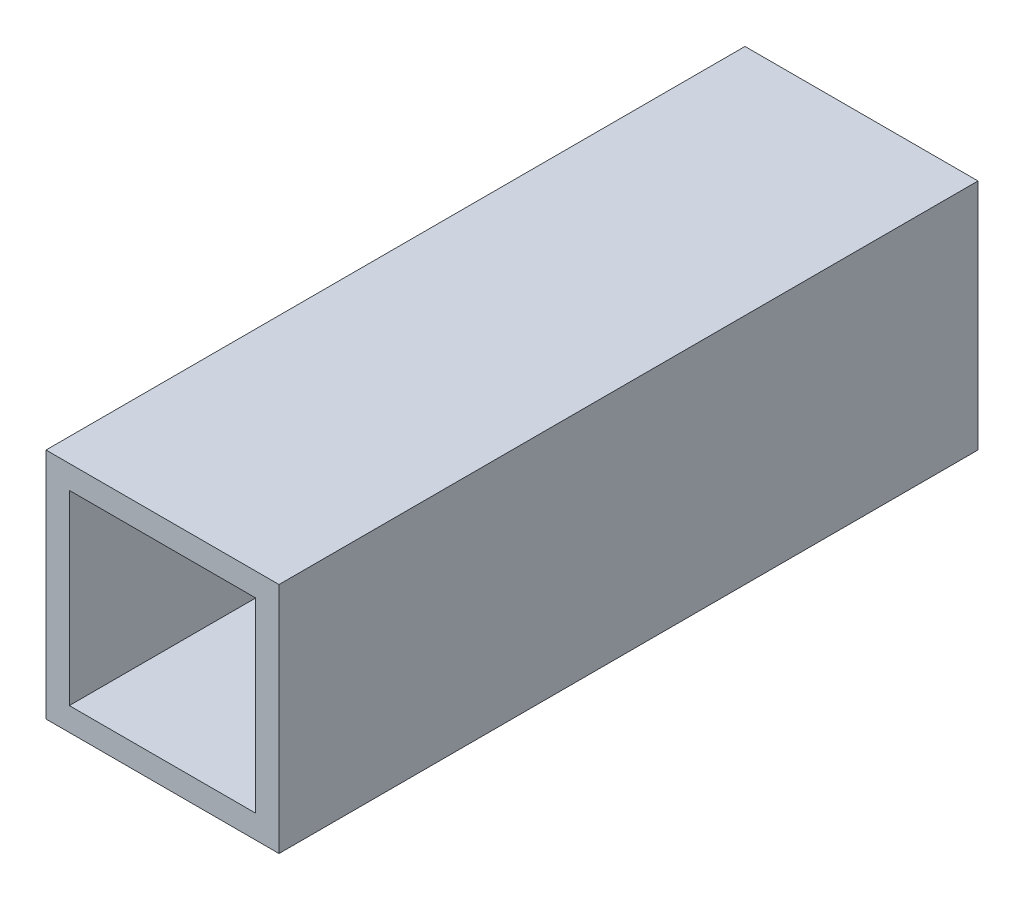
ISO-10303-21;
HEADER;
FILE_DESCRIPTION(('STEP AP214'),'2;1');
FILE_NAME('part.step','',(''),(''),'','','');
FILE_SCHEMA(('AUTOMOTIVE_DESIGN { 1 0 10303 214 1 1 1 1 }'));
ENDSEC;
DATA;
#1=APPLICATION_CONTEXT('core data for automotive mechanical design processes');
#2=APPLICATION_PROTOCOL_DEFINITION('international standard','automotive_design',2000,#1);
#3=PRODUCT_CONTEXT('',#1,'mechanical');
#4=PRODUCT('Part','Part','',(#3));
#5=PRODUCT_RELATED_PRODUCT_CATEGORY('part','',(#4));
#6=PRODUCT_DEFINITION_FORMATION('','',#4);
#7=PRODUCT_DEFINITION_CONTEXT('part definition',#1,'design');
#8=PRODUCT_DEFINITION('design','',#6,#7);
#9=PRODUCT_DEFINITION_SHAPE('','',#8);
#10=(LENGTH_UNIT() NAMED_UNIT(*) SI_UNIT(.MILLI.,.METRE.));
#11=(NAMED_UNIT(*) PLANE_ANGLE_UNIT() SI_UNIT($,.RADIAN.));
#12=(NAMED_UNIT(*) SI_UNIT($,.STERADIAN.) SOLID_ANGLE_UNIT());
#13=UNCERTAINTY_MEASURE_WITH_UNIT(LENGTH_MEASURE(1.E-05),#10,'distance_accuracy_value','');
#14=(GEOMETRIC_REPRESENTATION_CONTEXT(3) GLOBAL_UNCERTAINTY_ASSIGNED_CONTEXT((#13)) GLOBAL_UNIT_ASSIGNED_CONTEXT((#10,
#11,#12)) REPRESENTATION_CONTEXT('',''));
#15=CARTESIAN_POINT('',(0.,0.,0.));
#16=DIRECTION('',(0.,0.,1.));
#17=DIRECTION('',(1.,0.,0.));
#18=AXIS2_PLACEMENT_3D('',#15,#16,#17);
#19=CARTESIAN_POINT('',(0.,0.,150.));
#20=DIRECTION('',(0.,0.,1.));
#21=DIRECTION('',(1.,0.,0.));
#22=AXIS2_PLACEMENT_3D('',#19,#20,#21);
#23=PLANE('',#22);
#24=DIRECTION('',(0.,-1.,0.));
#25=VECTOR('',#24,1.);
#26=CARTESIAN_POINT('',(-25.,25.,150.));
#27=LINE('',#26,#25);
#28=CARTESIAN_POINT('',(-25.,25.,150.));
#29=VERTEX_POINT('',#28);
#30=CARTESIAN_POINT('',(-25.,-25.,150.));
#31=VERTEX_POINT('',#30);
#32=EDGE_CURVE('E135',#29,#31,#27,.T.);
#33=ORIENTED_EDGE('',*,*,#32,.T.);
#34=DIRECTION('',(1.,0.,0.));
#35=VECTOR('',#34,1.);
#36=CARTESIAN_POINT('',(-25.,-25.,150.));
#37=LINE('',#36,#35);
#38=CARTESIAN_POINT('',(25.,-25.,150.));
#39=VERTEX_POINT('',#38);
#40=EDGE_CURVE('E138',#31,#39,#37,.T.);
#41=ORIENTED_EDGE('',*,*,#40,.T.);
#42=DIRECTION('',(0.,1.,0.));
#43=VECTOR('',#42,1.);
#44=CARTESIAN_POINT('',(25.,25.,150.));
#45=LINE('',#44,#43);
#46=CARTESIAN_POINT('',(25.,25.,150.));
#47=VERTEX_POINT('',#46);
#48=EDGE_CURVE('E141',#39,#47,#45,.T.);
#49=ORIENTED_EDGE('',*,*,#48,.T.);
#50=DIRECTION('',(-1.,0.,0.));
#51=VECTOR('',#50,1.);
#52=CARTESIAN_POINT('',(-25.,25.,150.));
#53=LINE('',#52,#51);
#54=EDGE_CURVE('E143',#47,#29,#53,.T.);
#55=ORIENTED_EDGE('',*,*,#54,.T.);
#56=EDGE_LOOP('',(#33,#41,#49,#55));
#57=FACE_BOUND('',#56,.T.);
#58=DIRECTION('',(0.,-1.,0.));
#59=VECTOR('',#58,1.);
#60=CARTESIAN_POINT('',(-20.,20.,150.));
#61=LINE('',#60,#59);
#62=CARTESIAN_POINT('',(-20.,20.,150.));
#63=VERTEX_POINT('',#62);
#64=CARTESIAN_POINT('',(-20.,-20.,150.));
#65=VERTEX_POINT('',#64);
#66=EDGE_CURVE('E107',#63,#65,#61,.T.);
#67=ORIENTED_EDGE('',*,*,#66,.F.);
#68=DIRECTION('',(-1.,0.,0.));
#69=VECTOR('',#68,1.);
#70=CARTESIAN_POINT('',(-20.,20.,150.));
#71=LINE('',#70,#69);
#72=CARTESIAN_POINT('',(20.,20.,150.));
#73=VERTEX_POINT('',#72);
#74=EDGE_CURVE('E99',#73,#63,#71,.T.);
#75=ORIENTED_EDGE('',*,*,#74,.F.);
#76=DIRECTION('',(0.,1.,0.));
#77=VECTOR('',#76,1.);
#78=CARTESIAN_POINT('',(20.,20.,150.));
#79=LINE('',#78,#77);
#80=CARTESIAN_POINT('',(20.,-20.,150.));
#81=VERTEX_POINT('',#80);
#82=EDGE_CURVE('E121',#81,#73,#79,.T.);
#83=ORIENTED_EDGE('',*,*,#82,.F.);
#84=DIRECTION('',(1.,0.,0.));
#85=VECTOR('',#84,1.);
#86=CARTESIAN_POINT('',(-20.,-20.,150.));
#87=LINE('',#86,#85);
#88=EDGE_CURVE('E119',#65,#81,#87,.T.);
#89=ORIENTED_EDGE('',*,*,#88,.F.);
#90=EDGE_LOOP('',(#67,#75,#83,#89));
#91=FACE_BOUND('',#90,.T.);
#92=ADVANCED_FACE('F34',(#57,#91),#23,.T.);
#93=CARTESIAN_POINT('',(0.,0.,0.));
#94=DIRECTION('',(0.,0.,1.));
#95=DIRECTION('',(1.,0.,0.));
#96=AXIS2_PLACEMENT_3D('',#93,#94,#95);
#97=PLANE('',#96);
#98=DIRECTION('',(0.,-1.,0.));
#99=VECTOR('',#98,1.);
#100=CARTESIAN_POINT('',(-25.,25.,0.));
#101=LINE('',#100,#99);
#102=CARTESIAN_POINT('',(-25.,25.,0.));
#103=VERTEX_POINT('',#102);
#104=CARTESIAN_POINT('',(-25.,-25.,0.));
#105=VERTEX_POINT('',#104);
#106=EDGE_CURVE('E115',#103,#105,#101,.T.);
#107=ORIENTED_EDGE('',*,*,#106,.F.);
#108=DIRECTION('',(-1.,0.,0.));
#109=VECTOR('',#108,1.);
#110=CARTESIAN_POINT('',(-25.,25.,0.));
#111=LINE('',#110,#109);
#112=CARTESIAN_POINT('',(25.,25.,0.));
#113=VERTEX_POINT('',#112);
#114=EDGE_CURVE('E139',#113,#103,#111,.T.);
#115=ORIENTED_EDGE('',*,*,#114,.F.);
#116=DIRECTION('',(0.,1.,0.));
#117=VECTOR('',#116,1.);
#118=CARTESIAN_POINT('',(25.,25.,0.));
#119=LINE('',#118,#117);
#120=CARTESIAN_POINT('',(25.,-25.,0.));
#121=VERTEX_POINT('',#120);
#122=EDGE_CURVE('E150',#121,#113,#119,.T.);
#123=ORIENTED_EDGE('',*,*,#122,.F.);
#124=DIRECTION('',(1.,0.,0.));
#125=VECTOR('',#124,1.);
#126=CARTESIAN_POINT('',(-25.,-25.,0.));
#127=LINE('',#126,#125);
#128=EDGE_CURVE('E148',#105,#121,#127,.T.);
#129=ORIENTED_EDGE('',*,*,#128,.F.);
#130=EDGE_LOOP('',(#107,#115,#123,#129));
#131=FACE_BOUND('',#130,.T.);
#132=DIRECTION('',(-1.,0.,0.));
#133=VECTOR('',#132,1.);
#134=CARTESIAN_POINT('',(-20.,20.,0.));
#135=LINE('',#134,#133);
#136=CARTESIAN_POINT('',(20.,20.,0.));
#137=VERTEX_POINT('',#136);
#138=CARTESIAN_POINT('',(-20.,20.,0.));
#139=VERTEX_POINT('',#138);
#140=EDGE_CURVE('E57',#137,#139,#135,.T.);
#141=ORIENTED_EDGE('',*,*,#140,.T.);
#142=DIRECTION('',(0.,-1.,0.));
#143=VECTOR('',#142,1.);
#144=CARTESIAN_POINT('',(-20.,20.,0.));
#145=LINE('',#144,#143);
#146=CARTESIAN_POINT('',(-20.,-20.,0.));
#147=VERTEX_POINT('',#146);
#148=EDGE_CURVE('E114',#139,#147,#145,.T.);
#149=ORIENTED_EDGE('',*,*,#148,.T.);
#150=DIRECTION('',(1.,0.,0.));
#151=VECTOR('',#150,1.);
#152=CARTESIAN_POINT('',(-20.,-20.,0.));
#153=LINE('',#152,#151);
#154=CARTESIAN_POINT('',(20.,-20.,0.));
#155=VERTEX_POINT('',#154);
#156=EDGE_CURVE('E127',#147,#155,#153,.T.);
#157=ORIENTED_EDGE('',*,*,#156,.T.);
#158=DIRECTION('',(0.,1.,0.));
#159=VECTOR('',#158,1.);
#160=CARTESIAN_POINT('',(20.,20.,0.));
#161=LINE('',#160,#159);
#162=EDGE_CURVE('E108',#155,#137,#161,.T.);
#163=ORIENTED_EDGE('',*,*,#162,.T.);
#164=EDGE_LOOP('',(#141,#149,#157,#163));
#165=FACE_BOUND('',#164,.T.);
#166=ADVANCED_FACE('F168',(#131,#165),#97,.F.);
#167=CARTESIAN_POINT('',(-25.,25.,150.));
#168=DIRECTION('',(1.,0.,0.));
#169=DIRECTION('',(0.,1.,0.));
#170=AXIS2_PLACEMENT_3D('',#167,#168,#169);
#171=PLANE('',#170);
#172=ORIENTED_EDGE('',*,*,#106,.T.);
#173=DIRECTION('',(0.,0.,-1.));
#174=VECTOR('',#173,1.);
#175=CARTESIAN_POINT('',(-25.,-25.,150.));
#176=LINE('',#175,#174);
#177=EDGE_CURVE('E11',#31,#105,#176,.T.);
#178=ORIENTED_EDGE('',*,*,#177,.F.);
#179=ORIENTED_EDGE('',*,*,#32,.F.);
#180=DIRECTION('',(0.,0.,-1.));
#181=VECTOR('',#180,1.);
#182=CARTESIAN_POINT('',(-25.,25.,150.));
#183=LINE('',#182,#181);
#184=EDGE_CURVE('E145',#29,#103,#183,.T.);
#185=ORIENTED_EDGE('',*,*,#184,.T.);
#186=EDGE_LOOP('',(#172,#178,#179,#185));
#187=FACE_BOUND('',#186,.T.);
#188=ADVANCED_FACE('F36',(#187),#171,.F.);
#189=CARTESIAN_POINT('',(-25.,-25.,150.));
#190=DIRECTION('',(0.,1.,0.));
#191=DIRECTION('',(0.,0.,1.));
#192=AXIS2_PLACEMENT_3D('',#189,#190,#191);
#193=PLANE('',#192);
#194=ORIENTED_EDGE('',*,*,#128,.T.);
#195=DIRECTION('',(0.,0.,-1.));
#196=VECTOR('',#195,1.);
#197=CARTESIAN_POINT('',(25.,-25.,150.));
#198=LINE('',#197,#196);
#199=EDGE_CURVE('E42',#39,#121,#198,.T.);
#200=ORIENTED_EDGE('',*,*,#199,.F.);
#201=ORIENTED_EDGE('',*,*,#40,.F.);
#202=ORIENTED_EDGE('',*,*,#177,.T.);
#203=EDGE_LOOP('',(#194,#200,#201,#202));
#204=FACE_BOUND('',#203,.T.);
#205=ADVANCED_FACE('F178',(#204),#193,.F.);
#206=CARTESIAN_POINT('',(25.,25.,150.));
#207=DIRECTION('',(-1.,0.,0.));
#208=DIRECTION('',(0.,-1.,0.));
#209=AXIS2_PLACEMENT_3D('',#206,#207,#208);
#210=PLANE('',#209);
#211=ORIENTED_EDGE('',*,*,#122,.T.);
#212=DIRECTION('',(0.,0.,-1.));
#213=VECTOR('',#212,1.);
#214=CARTESIAN_POINT('',(25.,25.,150.));
#215=LINE('',#214,#213);
#216=EDGE_CURVE('E155',#47,#113,#215,.T.);
#217=ORIENTED_EDGE('',*,*,#216,.F.);
#218=ORIENTED_EDGE('',*,*,#48,.F.);
#219=ORIENTED_EDGE('',*,*,#199,.T.);
#220=EDGE_LOOP('',(#211,#217,#218,#219));
#221=FACE_BOUND('',#220,.T.);
#222=ADVANCED_FACE('F162',(#221),#210,.F.);
#223=CARTESIAN_POINT('',(-25.,25.,150.));
#224=DIRECTION('',(0.,-1.,0.));
#225=DIRECTION('',(0.,0.,-1.));
#226=AXIS2_PLACEMENT_3D('',#223,#224,#225);
#227=PLANE('',#226);
#228=ORIENTED_EDGE('',*,*,#114,.T.);
#229=ORIENTED_EDGE('',*,*,#184,.F.);
#230=ORIENTED_EDGE('',*,*,#54,.F.);
#231=ORIENTED_EDGE('',*,*,#216,.T.);
#232=EDGE_LOOP('',(#228,#229,#230,#231));
#233=FACE_BOUND('',#232,.T.);
#234=ADVANCED_FACE('F172',(#233),#227,.F.);
#235=CARTESIAN_POINT('',(-20.,20.,150.));
#236=DIRECTION('',(0.,-1.,0.));
#237=DIRECTION('',(0.,0.,-1.));
#238=AXIS2_PLACEMENT_3D('',#235,#236,#237);
#239=PLANE('',#238);
#240=ORIENTED_EDGE('',*,*,#140,.F.);
#241=DIRECTION('',(0.,0.,-1.));
#242=VECTOR('',#241,1.);
#243=CARTESIAN_POINT('',(20.,20.,150.));
#244=LINE('',#243,#242);
#245=EDGE_CURVE('E103',#73,#137,#244,.T.);
#246=ORIENTED_EDGE('',*,*,#245,.F.);
#247=ORIENTED_EDGE('',*,*,#74,.T.);
#248=DIRECTION('',(0.,0.,-1.));
#249=VECTOR('',#248,1.);
#250=CARTESIAN_POINT('',(-20.,20.,150.));
#251=LINE('',#250,#249);
#252=EDGE_CURVE('E102',#63,#139,#251,.T.);
#253=ORIENTED_EDGE('',*,*,#252,.T.);
#254=EDGE_LOOP('',(#240,#246,#247,#253));
#255=FACE_BOUND('',#254,.T.);
#256=ADVANCED_FACE('F101',(#255),#239,.T.);
#257=CARTESIAN_POINT('',(-20.,20.,150.));
#258=DIRECTION('',(1.,0.,0.));
#259=DIRECTION('',(0.,1.,0.));
#260=AXIS2_PLACEMENT_3D('',#257,#258,#259);
#261=PLANE('',#260);
#262=ORIENTED_EDGE('',*,*,#148,.F.);
#263=ORIENTED_EDGE('',*,*,#252,.F.);
#264=ORIENTED_EDGE('',*,*,#66,.T.);
#265=DIRECTION('',(0.,0.,-1.));
#266=VECTOR('',#265,1.);
#267=CARTESIAN_POINT('',(-20.,-20.,150.));
#268=LINE('',#267,#266);
#269=EDGE_CURVE('E116',#65,#147,#268,.T.);
#270=ORIENTED_EDGE('',*,*,#269,.T.);
#271=EDGE_LOOP('',(#262,#263,#264,#270));
#272=FACE_BOUND('',#271,.T.);
#273=ADVANCED_FACE('F111',(#272),#261,.T.);
#274=CARTESIAN_POINT('',(-20.,-20.,150.));
#275=DIRECTION('',(0.,1.,0.));
#276=DIRECTION('',(0.,0.,1.));
#277=AXIS2_PLACEMENT_3D('',#274,#275,#276);
#278=PLANE('',#277);
#279=ORIENTED_EDGE('',*,*,#156,.F.);
#280=ORIENTED_EDGE('',*,*,#269,.F.);
#281=ORIENTED_EDGE('',*,*,#88,.T.);
#282=DIRECTION('',(0.,0.,-1.));
#283=VECTOR('',#282,1.);
#284=CARTESIAN_POINT('',(20.,-20.,150.));
#285=LINE('',#284,#283);
#286=EDGE_CURVE('E49',#81,#155,#285,.T.);
#287=ORIENTED_EDGE('',*,*,#286,.T.);
#288=EDGE_LOOP('',(#279,#280,#281,#287));
#289=FACE_BOUND('',#288,.T.);
#290=ADVANCED_FACE('F201',(#289),#278,.T.);
#291=CARTESIAN_POINT('',(20.,20.,150.));
#292=DIRECTION('',(-1.,0.,0.));
#293=DIRECTION('',(0.,-1.,0.));
#294=AXIS2_PLACEMENT_3D('',#291,#292,#293);
#295=PLANE('',#294);
#296=ORIENTED_EDGE('',*,*,#162,.F.);
#297=ORIENTED_EDGE('',*,*,#286,.F.);
#298=ORIENTED_EDGE('',*,*,#82,.T.);
#299=ORIENTED_EDGE('',*,*,#245,.T.);
#300=EDGE_LOOP('',(#296,#297,#298,#299));
#301=FACE_BOUND('',#300,.T.);
#302=ADVANCED_FACE('F205',(#301),#295,.T.);
#303=CLOSED_SHELL('',(#92,#166,#188,#205,#222,#234,#256,#273,#290,#302));
#304=MANIFOLD_SOLID_BREP('B2',#303);
#305=ADVANCED_BREP_SHAPE_REPRESENTATION('',(#18,#304),#14);
#306=SHAPE_DEFINITION_REPRESENTATION(#9,#305);
ENDSEC;
END-ISO-10303-21;
